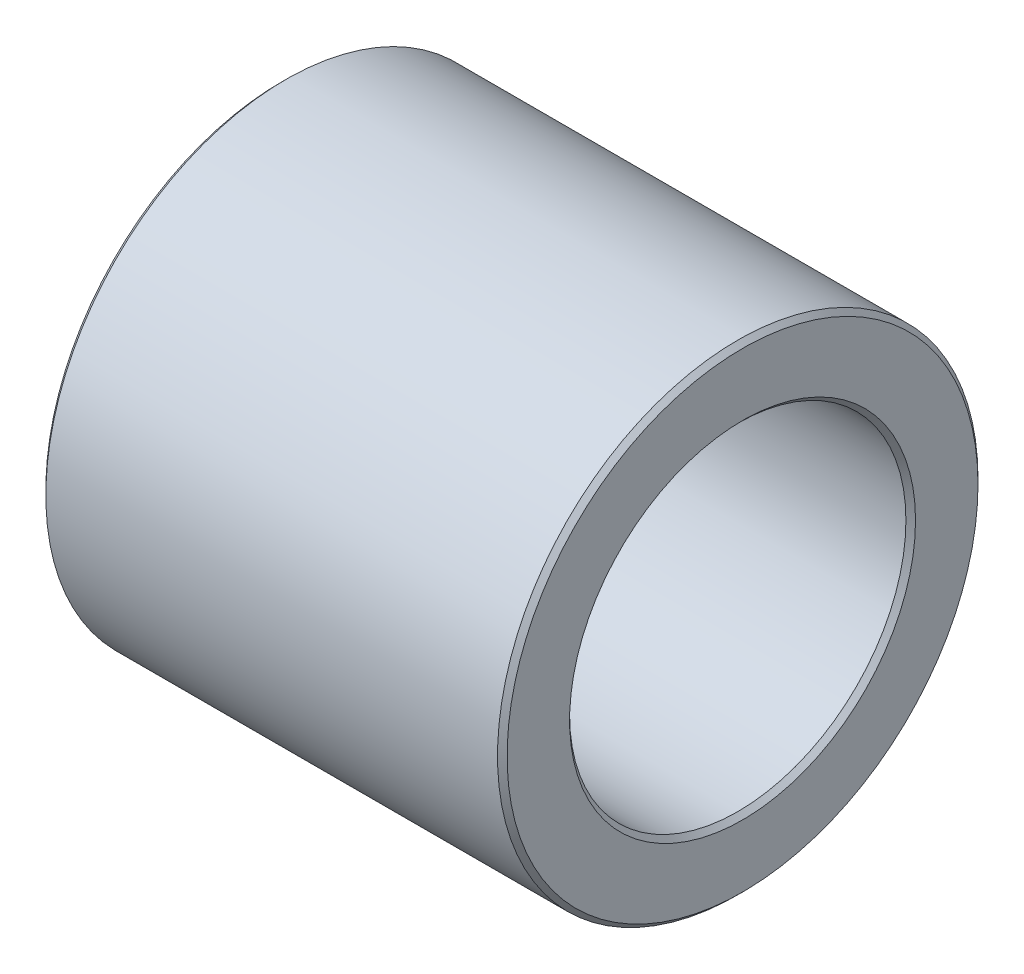
ISO-10303-21;
HEADER;
FILE_DESCRIPTION(('STEP AP214'),'2;1');
FILE_NAME('part.step','',(''),(''),'','','');
FILE_SCHEMA(('AUTOMOTIVE_DESIGN { 1 0 10303 214 1 1 1 1 }'));
ENDSEC;
DATA;
#1=APPLICATION_CONTEXT('core data for automotive mechanical design processes');
#2=APPLICATION_PROTOCOL_DEFINITION('international standard','automotive_design',2000,#1);
#3=PRODUCT_CONTEXT('',#1,'mechanical');
#4=PRODUCT('Part','Part','',(#3));
#5=PRODUCT_RELATED_PRODUCT_CATEGORY('part','',(#4));
#6=PRODUCT_DEFINITION_FORMATION('','',#4);
#7=PRODUCT_DEFINITION_CONTEXT('part definition',#1,'design');
#8=PRODUCT_DEFINITION('design','',#6,#7);
#9=PRODUCT_DEFINITION_SHAPE('','',#8);
#10=(LENGTH_UNIT() NAMED_UNIT(*) SI_UNIT(.MILLI.,.METRE.));
#11=(NAMED_UNIT(*) PLANE_ANGLE_UNIT() SI_UNIT($,.RADIAN.));
#12=(NAMED_UNIT(*) SI_UNIT($,.STERADIAN.) SOLID_ANGLE_UNIT());
#13=UNCERTAINTY_MEASURE_WITH_UNIT(LENGTH_MEASURE(1.E-05),#10,'distance_accuracy_value','');
#14=(GEOMETRIC_REPRESENTATION_CONTEXT(3) GLOBAL_UNCERTAINTY_ASSIGNED_CONTEXT((#13)) GLOBAL_UNIT_ASSIGNED_CONTEXT((#10,
#11,#12)) REPRESENTATION_CONTEXT('',''));
#15=CARTESIAN_POINT('',(0.,0.,0.));
#16=DIRECTION('',(0.,0.,1.));
#17=DIRECTION('',(1.,0.,0.));
#18=AXIS2_PLACEMENT_3D('',#15,#16,#17);
#19=CARTESIAN_POINT('',(96.,0.,0.));
#20=DIRECTION('',(1.,0.,0.));
#21=DIRECTION('',(0.,0.,-1.));
#22=AXIS2_PLACEMENT_3D('',#19,#20,#21);
#23=PLANE('',#22);
#24=CARTESIAN_POINT('',(96.,0.,0.));
#25=DIRECTION('',(1.,0.,0.));
#26=DIRECTION('',(0.,0.,-1.));
#27=AXIS2_PLACEMENT_3D('',#24,#25,#26);
#28=CIRCLE('',#27,36.);
#29=CARTESIAN_POINT('',(96.,0.,-36.0000000000001));
#30=VERTEX_POINT('',#29);
#31=EDGE_CURVE('E52',#30,#30,#28,.F.);
#32=ORIENTED_EDGE('',*,*,#31,.T.);
#33=EDGE_LOOP('',(#32));
#34=FACE_BOUND('',#33,.T.);
#35=CARTESIAN_POINT('',(96.,0.,0.));
#36=DIRECTION('',(1.,0.,0.));
#37=DIRECTION('',(0.,0.,-1.));
#38=AXIS2_PLACEMENT_3D('',#35,#36,#37);
#39=CIRCLE('',#38,49.);
#40=CARTESIAN_POINT('',(96.,0.,-49.));
#41=VERTEX_POINT('',#40);
#42=EDGE_CURVE('E55',#41,#41,#39,.T.);
#43=ORIENTED_EDGE('',*,*,#42,.T.);
#44=EDGE_LOOP('',(#43));
#45=FACE_BOUND('',#44,.T.);
#46=ADVANCED_FACE('F32',(#34,#45),#23,.T.);
#47=CARTESIAN_POINT('',(0.,0.,0.));
#48=DIRECTION('',(1.,0.,0.));
#49=DIRECTION('',(0.,0.,-1.));
#50=AXIS2_PLACEMENT_3D('',#47,#48,#49);
#51=PLANE('',#50);
#52=CARTESIAN_POINT('',(0.,0.,0.));
#53=DIRECTION('',(1.,0.,0.));
#54=DIRECTION('',(0.,0.,-1.));
#55=AXIS2_PLACEMENT_3D('',#52,#53,#54);
#56=CIRCLE('',#55,36.);
#57=CARTESIAN_POINT('',(0.,0.,-36.));
#58=VERTEX_POINT('',#57);
#59=EDGE_CURVE('E10',#58,#58,#56,.T.);
#60=ORIENTED_EDGE('',*,*,#59,.T.);
#61=EDGE_LOOP('',(#60));
#62=FACE_BOUND('',#61,.T.);
#63=CARTESIAN_POINT('',(0.,0.,0.));
#64=DIRECTION('',(1.,0.,0.));
#65=DIRECTION('',(0.,0.,-1.));
#66=AXIS2_PLACEMENT_3D('',#63,#64,#65);
#67=CIRCLE('',#66,49.);
#68=CARTESIAN_POINT('',(0.,0.,-49.));
#69=VERTEX_POINT('',#68);
#70=EDGE_CURVE('E39',#69,#69,#67,.F.);
#71=ORIENTED_EDGE('',*,*,#70,.T.);
#72=EDGE_LOOP('',(#71));
#73=FACE_BOUND('',#72,.T.);
#74=ADVANCED_FACE('F80',(#62,#73),#51,.F.);
#75=CARTESIAN_POINT('',(96.,0.,0.));
#76=DIRECTION('',(-1.,0.,0.));
#77=DIRECTION('',(0.,0.,1.));
#78=AXIS2_PLACEMENT_3D('',#75,#76,#77);
#79=CYLINDRICAL_SURFACE('',#78,50.);
#80=CARTESIAN_POINT('',(95.,0.,0.));
#81=DIRECTION('',(1.,0.,0.));
#82=DIRECTION('',(0.,0.,-1.));
#83=AXIS2_PLACEMENT_3D('',#80,#81,#82);
#84=CIRCLE('',#83,50.);
#85=CARTESIAN_POINT('',(95.,0.,-50.));
#86=VERTEX_POINT('',#85);
#87=EDGE_CURVE('E43',#86,#86,#84,.F.);
#88=ORIENTED_EDGE('',*,*,#87,.T.);
#89=EDGE_LOOP('',(#88));
#90=FACE_BOUND('',#89,.T.);
#91=CARTESIAN_POINT('',(1.,0.,0.));
#92=DIRECTION('',(1.,0.,0.));
#93=DIRECTION('',(0.,0.,-1.));
#94=AXIS2_PLACEMENT_3D('',#91,#92,#93);
#95=CIRCLE('',#94,50.);
#96=CARTESIAN_POINT('',(1.,0.,-50.));
#97=VERTEX_POINT('',#96);
#98=EDGE_CURVE('E47',#97,#97,#95,.T.);
#99=ORIENTED_EDGE('',*,*,#98,.T.);
#100=EDGE_LOOP('',(#99));
#101=FACE_BOUND('',#100,.T.);
#102=ADVANCED_FACE('F86',(#90,#101),#79,.T.);
#103=CARTESIAN_POINT('',(96.,0.,0.));
#104=DIRECTION('',(-1.,0.,0.));
#105=DIRECTION('',(0.,0.,1.));
#106=AXIS2_PLACEMENT_3D('',#103,#104,#105);
#107=CYLINDRICAL_SURFACE('',#106,35.);
#108=CARTESIAN_POINT('',(95.,0.,0.));
#109=DIRECTION('',(1.,0.,0.));
#110=DIRECTION('',(0.,0.,-1.));
#111=AXIS2_PLACEMENT_3D('',#108,#109,#110);
#112=CIRCLE('',#111,35.);
#113=CARTESIAN_POINT('',(95.,0.,-35.));
#114=VERTEX_POINT('',#113);
#115=EDGE_CURVE('E58',#114,#114,#112,.T.);
#116=ORIENTED_EDGE('',*,*,#115,.T.);
#117=EDGE_LOOP('',(#116));
#118=FACE_BOUND('',#117,.T.);
#119=CARTESIAN_POINT('',(1.,0.,0.));
#120=DIRECTION('',(1.,0.,0.));
#121=DIRECTION('',(0.,0.,-1.));
#122=AXIS2_PLACEMENT_3D('',#119,#120,#121);
#123=CIRCLE('',#122,35.);
#124=CARTESIAN_POINT('',(1.,0.,-35.));
#125=VERTEX_POINT('',#124);
#126=EDGE_CURVE('E61',#125,#125,#123,.F.);
#127=ORIENTED_EDGE('',*,*,#126,.T.);
#128=EDGE_LOOP('',(#127));
#129=FACE_BOUND('',#128,.T.);
#130=ADVANCED_FACE('F65',(#118,#129),#107,.F.);
#131=CARTESIAN_POINT('',(95.,0.,0.));
#132=DIRECTION('',(1.,0.,0.));
#133=DIRECTION('',(0.,0.,-1.));
#134=AXIS2_PLACEMENT_3D('',#131,#132,#133);
#135=CONICAL_SURFACE('',#134,35.,0.785398163397459);
#136=ORIENTED_EDGE('',*,*,#31,.F.);
#137=EDGE_LOOP('',(#136));
#138=FACE_BOUND('',#137,.T.);
#139=ORIENTED_EDGE('',*,*,#115,.F.);
#140=EDGE_LOOP('',(#139));
#141=FACE_BOUND('',#140,.T.);
#142=ADVANCED_FACE('F76',(#138,#141),#135,.F.);
#143=CARTESIAN_POINT('',(96.,0.,0.));
#144=DIRECTION('',(-1.,0.,0.));
#145=DIRECTION('',(0.,0.,1.));
#146=AXIS2_PLACEMENT_3D('',#143,#144,#145);
#147=CONICAL_SURFACE('',#146,49.,0.785398163397445);
#148=ORIENTED_EDGE('',*,*,#87,.F.);
#149=EDGE_LOOP('',(#148));
#150=FACE_BOUND('',#149,.T.);
#151=ORIENTED_EDGE('',*,*,#42,.F.);
#152=EDGE_LOOP('',(#151));
#153=FACE_BOUND('',#152,.T.);
#154=ADVANCED_FACE('F70',(#150,#153),#147,.T.);
#155=CARTESIAN_POINT('',(0.,0.,0.));
#156=DIRECTION('',(-1.,0.,0.));
#157=DIRECTION('',(0.,0.,1.));
#158=AXIS2_PLACEMENT_3D('',#155,#156,#157);
#159=CONICAL_SURFACE('',#158,36.,0.785398163397438);
#160=ORIENTED_EDGE('',*,*,#126,.F.);
#161=EDGE_LOOP('',(#160));
#162=FACE_BOUND('',#161,.T.);
#163=ORIENTED_EDGE('',*,*,#59,.F.);
#164=EDGE_LOOP('',(#163));
#165=FACE_BOUND('',#164,.T.);
#166=ADVANCED_FACE('F67',(#162,#165),#159,.F.);
#167=CARTESIAN_POINT('',(1.,0.,0.));
#168=DIRECTION('',(1.,0.,0.));
#169=DIRECTION('',(0.,0.,-1.));
#170=AXIS2_PLACEMENT_3D('',#167,#168,#169);
#171=CONICAL_SURFACE('',#170,50.,0.785398163397448);
#172=ORIENTED_EDGE('',*,*,#70,.F.);
#173=EDGE_LOOP('',(#172));
#174=FACE_BOUND('',#173,.T.);
#175=ORIENTED_EDGE('',*,*,#98,.F.);
#176=EDGE_LOOP('',(#175));
#177=FACE_BOUND('',#176,.T.);
#178=ADVANCED_FACE('F34',(#174,#177),#171,.T.);
#179=CLOSED_SHELL('',(#46,#74,#102,#130,#142,#154,#166,#178));
#180=MANIFOLD_SOLID_BREP('B2',#179);
#181=ADVANCED_BREP_SHAPE_REPRESENTATION('',(#18,#180),#14);
#182=SHAPE_DEFINITION_REPRESENTATION(#9,#181);
ENDSEC;
END-ISO-10303-21;
